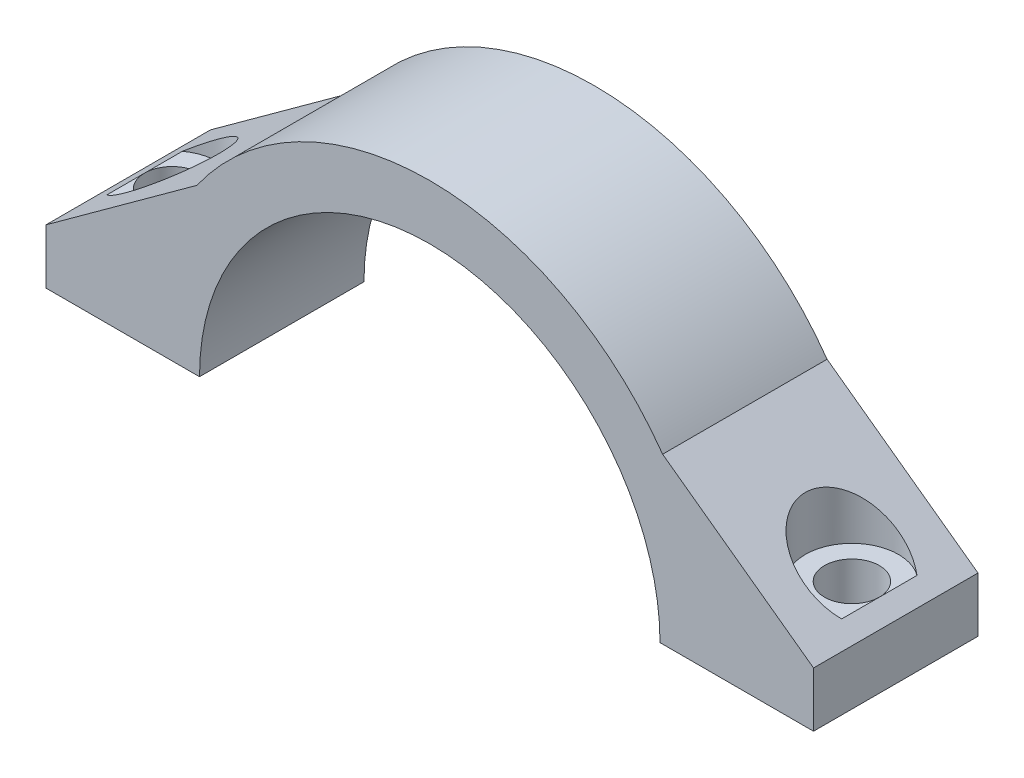
ISO-10303-21;
HEADER;
FILE_DESCRIPTION(('STEP AP214'),'2;1');
FILE_NAME('part.step','',(''),(''),'','','');
FILE_SCHEMA(('AUTOMOTIVE_DESIGN { 1 0 10303 214 1 1 1 1 }'));
ENDSEC;
DATA;
#1=APPLICATION_CONTEXT('core data for automotive mechanical design processes');
#2=APPLICATION_PROTOCOL_DEFINITION('international standard','automotive_design',2000,#1);
#3=PRODUCT_CONTEXT('',#1,'mechanical');
#4=PRODUCT('Part','Part','',(#3));
#5=PRODUCT_RELATED_PRODUCT_CATEGORY('part','',(#4));
#6=PRODUCT_DEFINITION_FORMATION('','',#4);
#7=PRODUCT_DEFINITION_CONTEXT('part definition',#1,'design');
#8=PRODUCT_DEFINITION('design','',#6,#7);
#9=PRODUCT_DEFINITION_SHAPE('','',#8);
#10=(LENGTH_UNIT() NAMED_UNIT(*) SI_UNIT(.MILLI.,.METRE.));
#11=(NAMED_UNIT(*) PLANE_ANGLE_UNIT() SI_UNIT($,.RADIAN.));
#12=(NAMED_UNIT(*) SI_UNIT($,.STERADIAN.) SOLID_ANGLE_UNIT());
#13=UNCERTAINTY_MEASURE_WITH_UNIT(LENGTH_MEASURE(1.E-05),#10,'distance_accuracy_value','');
#14=(GEOMETRIC_REPRESENTATION_CONTEXT(3) GLOBAL_UNCERTAINTY_ASSIGNED_CONTEXT((#13)) GLOBAL_UNIT_ASSIGNED_CONTEXT((#10,
#11,#12)) REPRESENTATION_CONTEXT('',''));
#15=CARTESIAN_POINT('',(0.,0.,0.));
#16=DIRECTION('',(0.,0.,1.));
#17=DIRECTION('',(1.,0.,0.));
#18=AXIS2_PLACEMENT_3D('',#15,#16,#17);
#19=CARTESIAN_POINT('',(0.,0.,7.5));
#20=DIRECTION('',(0.,0.,-1.));
#21=DIRECTION('',(-1.,0.,0.));
#22=AXIS2_PLACEMENT_3D('',#19,#20,#21);
#23=CYLINDRICAL_SURFACE('',#22,26.);
#24=DIRECTION('',(0.,0.,-1.));
#25=VECTOR('',#24,1.);
#26=CARTESIAN_POINT('',(-21.2367605815953,15.,7.5));
#27=LINE('',#26,#25);
#28=CARTESIAN_POINT('',(-21.2367605815953,15.,7.5));
#29=VERTEX_POINT('',#28);
#30=CARTESIAN_POINT('',(-21.2367605815953,15.,-7.5));
#31=VERTEX_POINT('',#30);
#32=EDGE_CURVE('E69',#29,#31,#27,.T.);
#33=ORIENTED_EDGE('',*,*,#32,.F.);
#34=CARTESIAN_POINT('',(0.,0.,7.5));
#35=DIRECTION('',(0.,0.,1.));
#36=DIRECTION('',(1.,0.,0.));
#37=AXIS2_PLACEMENT_3D('',#34,#35,#36);
#38=CIRCLE('',#37,26.);
#39=CARTESIAN_POINT('',(21.2367605815953,15.,7.5));
#40=VERTEX_POINT('',#39);
#41=EDGE_CURVE('E219',#40,#29,#38,.T.);
#42=ORIENTED_EDGE('',*,*,#41,.F.);
#43=DIRECTION('',(0.,0.,-1.));
#44=VECTOR('',#43,1.);
#45=CARTESIAN_POINT('',(21.2367605815953,15.,7.5));
#46=LINE('',#45,#44);
#47=CARTESIAN_POINT('',(21.2367605815953,15.,-7.5));
#48=VERTEX_POINT('',#47);
#49=EDGE_CURVE('E205',#40,#48,#46,.T.);
#50=ORIENTED_EDGE('',*,*,#49,.T.);
#51=CARTESIAN_POINT('',(0.,0.,-7.5));
#52=DIRECTION('',(0.,0.,1.));
#53=DIRECTION('',(1.,0.,0.));
#54=AXIS2_PLACEMENT_3D('',#51,#52,#53);
#55=CIRCLE('',#54,26.);
#56=EDGE_CURVE('E218',#48,#31,#55,.T.);
#57=ORIENTED_EDGE('',*,*,#56,.T.);
#58=EDGE_LOOP('',(#33,#42,#50,#57));
#59=FACE_BOUND('',#58,.T.);
#60=ADVANCED_FACE('F44',(#59),#23,.T.);
#61=CARTESIAN_POINT('',(-26.,0.,7.5));
#62=DIRECTION('',(0.,1.,0.));
#63=DIRECTION('',(0.,0.,1.));
#64=AXIS2_PLACEMENT_3D('',#61,#62,#63);
#65=PLANE('',#64);
#66=CARTESIAN_POINT('',(-31.,0.,0.));
#67=DIRECTION('',(0.,1.,0.));
#68=DIRECTION('',(0.,0.,-1.));
#69=AXIS2_PLACEMENT_3D('',#66,#67,#68);
#70=CIRCLE('',#69,2.5);
#71=CARTESIAN_POINT('',(-31.,0.,-2.5));
#72=VERTEX_POINT('',#71);
#73=EDGE_CURVE('E149',#72,#72,#70,.T.);
#74=ORIENTED_EDGE('',*,*,#73,.T.);
#75=EDGE_LOOP('',(#74));
#76=FACE_BOUND('',#75,.T.);
#77=DIRECTION('',(1.,0.,0.));
#78=VECTOR('',#77,1.);
#79=CARTESIAN_POINT('',(-26.,0.,-7.5));
#80=LINE('',#79,#78);
#81=CARTESIAN_POINT('',(-35.,0.,-7.5));
#82=VERTEX_POINT('',#81);
#83=CARTESIAN_POINT('',(-21.,0.,-7.5));
#84=VERTEX_POINT('',#83);
#85=EDGE_CURVE('E237',#82,#84,#80,.T.);
#86=ORIENTED_EDGE('',*,*,#85,.T.);
#87=DIRECTION('',(0.,0.,-1.));
#88=VECTOR('',#87,1.);
#89=CARTESIAN_POINT('',(-21.,0.,7.5));
#90=LINE('',#89,#88);
#91=CARTESIAN_POINT('',(-21.,0.,7.5));
#92=VERTEX_POINT('',#91);
#93=EDGE_CURVE('E247',#92,#84,#90,.T.);
#94=ORIENTED_EDGE('',*,*,#93,.F.);
#95=DIRECTION('',(1.,0.,0.));
#96=VECTOR('',#95,1.);
#97=CARTESIAN_POINT('',(-26.,0.,7.5));
#98=LINE('',#97,#96);
#99=CARTESIAN_POINT('',(-35.,0.,7.5));
#100=VERTEX_POINT('',#99);
#101=EDGE_CURVE('E224',#100,#92,#98,.T.);
#102=ORIENTED_EDGE('',*,*,#101,.F.);
#103=DIRECTION('',(0.,0.,-1.));
#104=VECTOR('',#103,1.);
#105=CARTESIAN_POINT('',(-35.,0.,7.5));
#106=LINE('',#105,#104);
#107=EDGE_CURVE('E164',#100,#82,#106,.T.);
#108=ORIENTED_EDGE('',*,*,#107,.T.);
#109=EDGE_LOOP('',(#86,#94,#102,#108));
#110=FACE_BOUND('',#109,.T.);
#111=ADVANCED_FACE('F275',(#76,#110),#65,.F.);
#112=CARTESIAN_POINT('',(0.,0.,7.5));
#113=DIRECTION('',(0.,0.,-1.));
#114=DIRECTION('',(-1.,0.,0.));
#115=AXIS2_PLACEMENT_3D('',#112,#113,#114);
#116=CYLINDRICAL_SURFACE('',#115,21.);
#117=CARTESIAN_POINT('',(0.,0.,-7.5));
#118=DIRECTION('',(0.,0.,-1.));
#119=DIRECTION('',(1.,0.,0.));
#120=AXIS2_PLACEMENT_3D('',#117,#118,#119);
#121=CIRCLE('',#120,21.);
#122=CARTESIAN_POINT('',(21.,0.,-7.5));
#123=VERTEX_POINT('',#122);
#124=EDGE_CURVE('E239',#84,#123,#121,.T.);
#125=ORIENTED_EDGE('',*,*,#124,.T.);
#126=DIRECTION('',(0.,0.,-1.));
#127=VECTOR('',#126,1.);
#128=CARTESIAN_POINT('',(21.,0.,7.5));
#129=LINE('',#128,#127);
#130=CARTESIAN_POINT('',(21.,0.,7.5));
#131=VERTEX_POINT('',#130);
#132=EDGE_CURVE('E234',#131,#123,#129,.T.);
#133=ORIENTED_EDGE('',*,*,#132,.F.);
#134=CARTESIAN_POINT('',(0.,0.,7.5));
#135=DIRECTION('',(0.,0.,-1.));
#136=DIRECTION('',(1.,0.,0.));
#137=AXIS2_PLACEMENT_3D('',#134,#135,#136);
#138=CIRCLE('',#137,21.);
#139=EDGE_CURVE('E226',#92,#131,#138,.T.);
#140=ORIENTED_EDGE('',*,*,#139,.F.);
#141=ORIENTED_EDGE('',*,*,#93,.T.);
#142=EDGE_LOOP('',(#125,#133,#140,#141));
#143=FACE_BOUND('',#142,.T.);
#144=ADVANCED_FACE('F274',(#143),#116,.F.);
#145=CARTESIAN_POINT('',(21.,0.,7.5));
#146=DIRECTION('',(0.,1.,0.));
#147=DIRECTION('',(0.,0.,1.));
#148=AXIS2_PLACEMENT_3D('',#145,#146,#147);
#149=PLANE('',#148);
#150=CARTESIAN_POINT('',(31.,0.,0.));
#151=DIRECTION('',(0.,-1.,0.));
#152=DIRECTION('',(0.,0.,-1.));
#153=AXIS2_PLACEMENT_3D('',#150,#151,#152);
#154=CIRCLE('',#153,2.5);
#155=CARTESIAN_POINT('',(31.,0.,-2.5));
#156=VERTEX_POINT('',#155);
#157=EDGE_CURVE('E187',#156,#156,#154,.T.);
#158=ORIENTED_EDGE('',*,*,#157,.F.);
#159=EDGE_LOOP('',(#158));
#160=FACE_BOUND('',#159,.T.);
#161=DIRECTION('',(1.,0.,0.));
#162=VECTOR('',#161,1.);
#163=CARTESIAN_POINT('',(21.,0.,-7.5));
#164=LINE('',#163,#162);
#165=CARTESIAN_POINT('',(35.,0.,-7.5));
#166=VERTEX_POINT('',#165);
#167=EDGE_CURVE('E221',#123,#166,#164,.T.);
#168=ORIENTED_EDGE('',*,*,#167,.T.);
#169=DIRECTION('',(0.,0.,-1.));
#170=VECTOR('',#169,1.);
#171=CARTESIAN_POINT('',(35.,0.,7.5));
#172=LINE('',#171,#170);
#173=CARTESIAN_POINT('',(35.,0.,7.5));
#174=VERTEX_POINT('',#173);
#175=EDGE_CURVE('E214',#174,#166,#172,.T.);
#176=ORIENTED_EDGE('',*,*,#175,.F.);
#177=DIRECTION('',(1.,0.,0.));
#178=VECTOR('',#177,1.);
#179=CARTESIAN_POINT('',(21.,0.,7.5));
#180=LINE('',#179,#178);
#181=EDGE_CURVE('E227',#131,#174,#180,.T.);
#182=ORIENTED_EDGE('',*,*,#181,.F.);
#183=ORIENTED_EDGE('',*,*,#132,.T.);
#184=EDGE_LOOP('',(#168,#176,#182,#183));
#185=FACE_BOUND('',#184,.T.);
#186=ADVANCED_FACE('F292',(#160,#185),#149,.F.);
#187=CARTESIAN_POINT('',(0.,0.,7.5));
#188=DIRECTION('',(0.,0.,1.));
#189=DIRECTION('',(1.,0.,0.));
#190=AXIS2_PLACEMENT_3D('',#187,#188,#189);
#191=PLANE('',#190);
#192=ORIENTED_EDGE('',*,*,#181,.T.);
#193=DIRECTION('',(0.,1.,0.));
#194=VECTOR('',#193,1.);
#195=CARTESIAN_POINT('',(35.,0.,7.5));
#196=LINE('',#195,#194);
#197=CARTESIAN_POINT('',(35.,5.,7.5));
#198=VERTEX_POINT('',#197);
#199=EDGE_CURVE('E195',#174,#198,#196,.T.);
#200=ORIENTED_EDGE('',*,*,#199,.T.);
#201=DIRECTION('',(-0.809005219888587,0.587801458141283,0.));
#202=VECTOR('',#201,1.);
#203=CARTESIAN_POINT('',(35.,5.,7.5));
#204=LINE('',#203,#202);
#205=EDGE_CURVE('E196',#198,#40,#204,.T.);
#206=ORIENTED_EDGE('',*,*,#205,.T.);
#207=ORIENTED_EDGE('',*,*,#41,.T.);
#208=DIRECTION('',(0.809005219888587,0.587801458141283,0.));
#209=VECTOR('',#208,1.);
#210=CARTESIAN_POINT('',(-35.,5.,7.5));
#211=LINE('',#210,#209);
#212=CARTESIAN_POINT('',(-35.,5.,7.5));
#213=VERTEX_POINT('',#212);
#214=EDGE_CURVE('E156',#213,#29,#211,.T.);
#215=ORIENTED_EDGE('',*,*,#214,.F.);
#216=DIRECTION('',(0.,1.,0.));
#217=VECTOR('',#216,1.);
#218=CARTESIAN_POINT('',(-35.,0.,7.5));
#219=LINE('',#218,#217);
#220=EDGE_CURVE('E159',#100,#213,#219,.T.);
#221=ORIENTED_EDGE('',*,*,#220,.F.);
#222=ORIENTED_EDGE('',*,*,#101,.T.);
#223=ORIENTED_EDGE('',*,*,#139,.T.);
#224=EDGE_LOOP('',(#192,#200,#206,#207,#215,#221,#222,#223));
#225=FACE_BOUND('',#224,.T.);
#226=ADVANCED_FACE('F298',(#225),#191,.T.);
#227=CARTESIAN_POINT('',(0.,0.,-7.5));
#228=DIRECTION('',(0.,0.,1.));
#229=DIRECTION('',(1.,0.,0.));
#230=AXIS2_PLACEMENT_3D('',#227,#228,#229);
#231=PLANE('',#230);
#232=ORIENTED_EDGE('',*,*,#56,.F.);
#233=DIRECTION('',(-0.809005219888587,0.587801458141283,0.));
#234=VECTOR('',#233,1.);
#235=CARTESIAN_POINT('',(35.,5.,-7.5));
#236=LINE('',#235,#234);
#237=CARTESIAN_POINT('',(35.,5.,-7.5));
#238=VERTEX_POINT('',#237);
#239=EDGE_CURVE('E200',#238,#48,#236,.T.);
#240=ORIENTED_EDGE('',*,*,#239,.F.);
#241=DIRECTION('',(0.,1.,0.));
#242=VECTOR('',#241,1.);
#243=CARTESIAN_POINT('',(35.,0.,-7.5));
#244=LINE('',#243,#242);
#245=EDGE_CURVE('E201',#166,#238,#244,.T.);
#246=ORIENTED_EDGE('',*,*,#245,.F.);
#247=ORIENTED_EDGE('',*,*,#167,.F.);
#248=ORIENTED_EDGE('',*,*,#124,.F.);
#249=ORIENTED_EDGE('',*,*,#85,.F.);
#250=DIRECTION('',(0.,1.,0.));
#251=VECTOR('',#250,1.);
#252=CARTESIAN_POINT('',(-35.,0.,-7.5));
#253=LINE('',#252,#251);
#254=CARTESIAN_POINT('',(-35.,5.,-7.5));
#255=VERTEX_POINT('',#254);
#256=EDGE_CURVE('E161',#82,#255,#253,.T.);
#257=ORIENTED_EDGE('',*,*,#256,.T.);
#258=DIRECTION('',(0.809005219888587,0.587801458141283,0.));
#259=VECTOR('',#258,1.);
#260=CARTESIAN_POINT('',(-35.,5.,-7.5));
#261=LINE('',#260,#259);
#262=EDGE_CURVE('E167',#255,#31,#261,.T.);
#263=ORIENTED_EDGE('',*,*,#262,.T.);
#264=EDGE_LOOP('',(#232,#240,#246,#247,#248,#249,#257,#263));
#265=FACE_BOUND('',#264,.T.);
#266=ADVANCED_FACE('F286',(#265),#231,.F.);
#267=CARTESIAN_POINT('',(35.,0.,7.5));
#268=DIRECTION('',(-1.,0.,0.));
#269=DIRECTION('',(0.,0.,1.));
#270=AXIS2_PLACEMENT_3D('',#267,#268,#269);
#271=PLANE('',#270);
#272=ORIENTED_EDGE('',*,*,#245,.T.);
#273=DIRECTION('',(0.,0.,-1.));
#274=VECTOR('',#273,1.);
#275=CARTESIAN_POINT('',(35.,5.,7.5));
#276=LINE('',#275,#274);
#277=EDGE_CURVE('E211',#198,#238,#276,.T.);
#278=ORIENTED_EDGE('',*,*,#277,.F.);
#279=ORIENTED_EDGE('',*,*,#199,.F.);
#280=ORIENTED_EDGE('',*,*,#175,.T.);
#281=EDGE_LOOP('',(#272,#278,#279,#280));
#282=FACE_BOUND('',#281,.T.);
#283=ADVANCED_FACE('F293',(#282),#271,.F.);
#284=CARTESIAN_POINT('',(35.,5.,7.5));
#285=DIRECTION('',(-0.587801458141283,-0.809005219888587,0.));
#286=DIRECTION('',(0.809005219888587,-0.587801458141283,0.));
#287=AXIS2_PLACEMENT_3D('',#284,#285,#286);
#288=PLANE('',#287);
#289=CARTESIAN_POINT('',(31.,7.90629253651655,0.));
#290=DIRECTION('',(-0.587801458141283,-0.809005219888587,0.));
#291=DIRECTION('',(0.809005219888587,-0.587801458141283,0.));
#292=AXIS2_PLACEMENT_3D('',#289,#290,#291);
#293=ELLIPSE('',#292,5.2533653621979,4.25);
#294=CARTESIAN_POINT('',(33.4998069033939,6.09,3.43707222003616));
#295=VERTEX_POINT('',#294);
#296=CARTESIAN_POINT('',(33.4998069033939,6.09,-3.43707222003616));
#297=VERTEX_POINT('',#296);
#298=EDGE_CURVE('E256',#295,#297,#293,.T.);
#299=ORIENTED_EDGE('',*,*,#298,.T.);
#300=DIRECTION('',(0.,0.,1.));
#301=VECTOR('',#300,1.);
#302=CARTESIAN_POINT('',(33.4998069033939,6.09,7.5));
#303=LINE('',#302,#301);
#304=CARTESIAN_POINT('',(33.4998069033939,6.09,-0.0310716228131394));
#305=VERTEX_POINT('',#304);
#306=EDGE_CURVE('E188',#297,#305,#303,.T.);
#307=ORIENTED_EDGE('',*,*,#306,.T.);
#308=CARTESIAN_POINT('',(31.,7.90629253651655,0.));
#309=DIRECTION('',(-0.587801458141283,-0.809005219888587,0.));
#310=DIRECTION('',(0.809005219888587,-0.587801458141283,0.));
#311=AXIS2_PLACEMENT_3D('',#308,#309,#310);
#312=ELLIPSE('',#311,3.09021491893994,2.5);
#313=CARTESIAN_POINT('',(33.4998069033939,6.09,0.0310716228131411));
#314=VERTEX_POINT('',#313);
#315=EDGE_CURVE('E193',#305,#314,#312,.T.);
#316=ORIENTED_EDGE('',*,*,#315,.T.);
#317=EDGE_CURVE('E183',#314,#295,#303,.T.);
#318=ORIENTED_EDGE('',*,*,#317,.T.);
#319=EDGE_LOOP('',(#299,#307,#316,#318));
#320=FACE_BOUND('',#319,.T.);
#321=ORIENTED_EDGE('',*,*,#239,.T.);
#322=ORIENTED_EDGE('',*,*,#49,.F.);
#323=ORIENTED_EDGE('',*,*,#205,.F.);
#324=ORIENTED_EDGE('',*,*,#277,.T.);
#325=EDGE_LOOP('',(#321,#322,#323,#324));
#326=FACE_BOUND('',#325,.T.);
#327=ADVANCED_FACE('F308',(#320,#326),#288,.F.);
#328=CARTESIAN_POINT('',(31.,26.,0.));
#329=DIRECTION('',(0.,-1.,0.));
#330=DIRECTION('',(0.,0.,-1.));
#331=AXIS2_PLACEMENT_3D('',#328,#329,#330);
#332=CYLINDRICAL_SURFACE('',#331,2.5);
#333=ORIENTED_EDGE('',*,*,#157,.T.);
#334=EDGE_LOOP('',(#333));
#335=FACE_BOUND('',#334,.T.);
#336=ORIENTED_EDGE('',*,*,#315,.F.);
#337=CARTESIAN_POINT('',(31.,6.09,0.));
#338=DIRECTION('',(0.,-1.,0.));
#339=DIRECTION('',(0.,0.,-1.));
#340=AXIS2_PLACEMENT_3D('',#337,#338,#339);
#341=CIRCLE('',#340,2.5);
#342=EDGE_CURVE('E253',#305,#314,#341,.F.);
#343=ORIENTED_EDGE('',*,*,#342,.T.);
#344=EDGE_LOOP('',(#336,#343));
#345=FACE_BOUND('',#344,.T.);
#346=ADVANCED_FACE('F306',(#335,#345),#332,.F.);
#347=CARTESIAN_POINT('',(31.,26.,0.));
#348=DIRECTION('',(0.,-1.,0.));
#349=DIRECTION('',(0.,0.,-1.));
#350=AXIS2_PLACEMENT_3D('',#347,#348,#349);
#351=CYLINDRICAL_SURFACE('',#350,4.25);
#352=CARTESIAN_POINT('',(31.,6.09,0.));
#353=DIRECTION('',(0.,-1.,0.));
#354=DIRECTION('',(0.,0.,-1.));
#355=AXIS2_PLACEMENT_3D('',#352,#353,#354);
#356=CIRCLE('',#355,4.25);
#357=EDGE_CURVE('E182',#295,#297,#356,.T.);
#358=ORIENTED_EDGE('',*,*,#357,.T.);
#359=ORIENTED_EDGE('',*,*,#298,.F.);
#360=EDGE_LOOP('',(#358,#359));
#361=FACE_BOUND('',#360,.T.);
#362=ADVANCED_FACE('F312',(#361),#351,.F.);
#363=CARTESIAN_POINT('',(31.,6.09,0.));
#364=DIRECTION('',(0.,-1.,0.));
#365=DIRECTION('',(0.,0.,-1.));
#366=AXIS2_PLACEMENT_3D('',#363,#364,#365);
#367=PLANE('',#366);
#368=ORIENTED_EDGE('',*,*,#357,.F.);
#369=ORIENTED_EDGE('',*,*,#317,.F.);
#370=ORIENTED_EDGE('',*,*,#342,.F.);
#371=ORIENTED_EDGE('',*,*,#306,.F.);
#372=EDGE_LOOP('',(#368,#369,#370,#371));
#373=FACE_BOUND('',#372,.T.);
#374=ADVANCED_FACE('F327',(#373),#367,.F.);
#375=CARTESIAN_POINT('',(-35.,5.,7.5));
#376=DIRECTION('',(-0.587801458141283,0.809005219888587,0.));
#377=DIRECTION('',(-0.809005219888587,-0.587801458141283,0.));
#378=AXIS2_PLACEMENT_3D('',#375,#376,#377);
#379=PLANE('',#378);
#380=DIRECTION('',(0.,0.,1.));
#381=VECTOR('',#380,1.);
#382=CARTESIAN_POINT('',(-33.4998069033939,6.09,7.5));
#383=LINE('',#382,#381);
#384=CARTESIAN_POINT('',(-33.4998069033939,6.09,-3.43707222003616));
#385=VERTEX_POINT('',#384);
#386=CARTESIAN_POINT('',(-33.4998069033939,6.09,-0.0310716228131394));
#387=VERTEX_POINT('',#386);
#388=EDGE_CURVE('E58',#385,#387,#383,.T.);
#389=ORIENTED_EDGE('',*,*,#388,.F.);
#390=CARTESIAN_POINT('',(-31.,7.90629253651655,0.));
#391=DIRECTION('',(-0.587801458141283,0.809005219888587,0.));
#392=DIRECTION('',(-0.809005219888587,-0.587801458141283,0.));
#393=AXIS2_PLACEMENT_3D('',#390,#391,#392);
#394=ELLIPSE('',#393,5.2533653621979,4.25);
#395=CARTESIAN_POINT('',(-33.4998069033939,6.09,3.43707222003616));
#396=VERTEX_POINT('',#395);
#397=EDGE_CURVE('E11',#385,#396,#394,.F.);
#398=ORIENTED_EDGE('',*,*,#397,.T.);
#399=CARTESIAN_POINT('',(-33.4998069033939,6.09,0.0310716228131411));
#400=VERTEX_POINT('',#399);
#401=EDGE_CURVE('E140',#400,#396,#383,.T.);
#402=ORIENTED_EDGE('',*,*,#401,.F.);
#403=CARTESIAN_POINT('',(-31.,7.90629253651655,0.));
#404=DIRECTION('',(-0.587801458141283,0.809005219888587,0.));
#405=DIRECTION('',(-0.809005219888587,-0.587801458141283,0.));
#406=AXIS2_PLACEMENT_3D('',#403,#404,#405);
#407=ELLIPSE('',#406,3.09021491893994,2.5);
#408=EDGE_CURVE('E150',#400,#387,#407,.F.);
#409=ORIENTED_EDGE('',*,*,#408,.T.);
#410=EDGE_LOOP('',(#389,#398,#402,#409));
#411=FACE_BOUND('',#410,.T.);
#412=ORIENTED_EDGE('',*,*,#262,.F.);
#413=DIRECTION('',(0.,0.,-1.));
#414=VECTOR('',#413,1.);
#415=CARTESIAN_POINT('',(-35.,5.,7.5));
#416=LINE('',#415,#414);
#417=EDGE_CURVE('E176',#213,#255,#416,.T.);
#418=ORIENTED_EDGE('',*,*,#417,.F.);
#419=ORIENTED_EDGE('',*,*,#214,.T.);
#420=ORIENTED_EDGE('',*,*,#32,.T.);
#421=EDGE_LOOP('',(#412,#418,#419,#420));
#422=FACE_BOUND('',#421,.T.);
#423=ADVANCED_FACE('F145',(#411,#422),#379,.T.);
#424=CARTESIAN_POINT('',(-35.,0.,7.5));
#425=DIRECTION('',(-1.,0.,0.));
#426=DIRECTION('',(0.,0.,1.));
#427=AXIS2_PLACEMENT_3D('',#424,#425,#426);
#428=PLANE('',#427);
#429=ORIENTED_EDGE('',*,*,#256,.F.);
#430=ORIENTED_EDGE('',*,*,#107,.F.);
#431=ORIENTED_EDGE('',*,*,#220,.T.);
#432=ORIENTED_EDGE('',*,*,#417,.T.);
#433=EDGE_LOOP('',(#429,#430,#431,#432));
#434=FACE_BOUND('',#433,.T.);
#435=ADVANCED_FACE('F268',(#434),#428,.T.);
#436=CARTESIAN_POINT('',(-31.,26.,0.));
#437=DIRECTION('',(0.,-1.,0.));
#438=DIRECTION('',(0.,0.,-1.));
#439=AXIS2_PLACEMENT_3D('',#436,#437,#438);
#440=CYLINDRICAL_SURFACE('',#439,2.5);
#441=CARTESIAN_POINT('',(-31.,6.09,0.));
#442=DIRECTION('',(0.,-1.,0.));
#443=DIRECTION('',(0.,0.,-1.));
#444=AXIS2_PLACEMENT_3D('',#441,#442,#443);
#445=CIRCLE('',#444,2.5);
#446=EDGE_CURVE('E52',#387,#400,#445,.T.);
#447=ORIENTED_EDGE('',*,*,#446,.F.);
#448=ORIENTED_EDGE('',*,*,#408,.F.);
#449=EDGE_LOOP('',(#447,#448));
#450=FACE_BOUND('',#449,.T.);
#451=ORIENTED_EDGE('',*,*,#73,.F.);
#452=EDGE_LOOP('',(#451));
#453=FACE_BOUND('',#452,.T.);
#454=ADVANCED_FACE('F264',(#450,#453),#440,.F.);
#455=CARTESIAN_POINT('',(-31.,26.,0.));
#456=DIRECTION('',(0.,-1.,0.));
#457=DIRECTION('',(0.,0.,-1.));
#458=AXIS2_PLACEMENT_3D('',#455,#456,#457);
#459=CYLINDRICAL_SURFACE('',#458,4.25);
#460=CARTESIAN_POINT('',(-31.,6.09,0.));
#461=DIRECTION('',(0.,1.,0.));
#462=DIRECTION('',(0.,0.,-1.));
#463=AXIS2_PLACEMENT_3D('',#460,#461,#462);
#464=CIRCLE('',#463,4.25);
#465=EDGE_CURVE('E136',#396,#385,#464,.T.);
#466=ORIENTED_EDGE('',*,*,#465,.F.);
#467=ORIENTED_EDGE('',*,*,#397,.F.);
#468=EDGE_LOOP('',(#466,#467));
#469=FACE_BOUND('',#468,.T.);
#470=ADVANCED_FACE('F132',(#469),#459,.F.);
#471=CARTESIAN_POINT('',(-31.,6.09,0.));
#472=DIRECTION('',(0.,-1.,0.));
#473=DIRECTION('',(0.,0.,-1.));
#474=AXIS2_PLACEMENT_3D('',#471,#472,#473);
#475=PLANE('',#474);
#476=ORIENTED_EDGE('',*,*,#388,.T.);
#477=ORIENTED_EDGE('',*,*,#446,.T.);
#478=ORIENTED_EDGE('',*,*,#401,.T.);
#479=ORIENTED_EDGE('',*,*,#465,.T.);
#480=EDGE_LOOP('',(#476,#477,#478,#479));
#481=FACE_BOUND('',#480,.T.);
#482=ADVANCED_FACE('F138',(#481),#475,.F.);
#483=CLOSED_SHELL('',(#60,#111,#144,#186,#226,#266,#283,#327,#346,#362,#374,#423,#435,#454,#470,#482));
#484=MANIFOLD_SOLID_BREP('B2',#483);
#485=ADVANCED_BREP_SHAPE_REPRESENTATION('',(#18,#484),#14);
#486=SHAPE_DEFINITION_REPRESENTATION(#9,#485);
ENDSEC;
END-ISO-10303-21;
